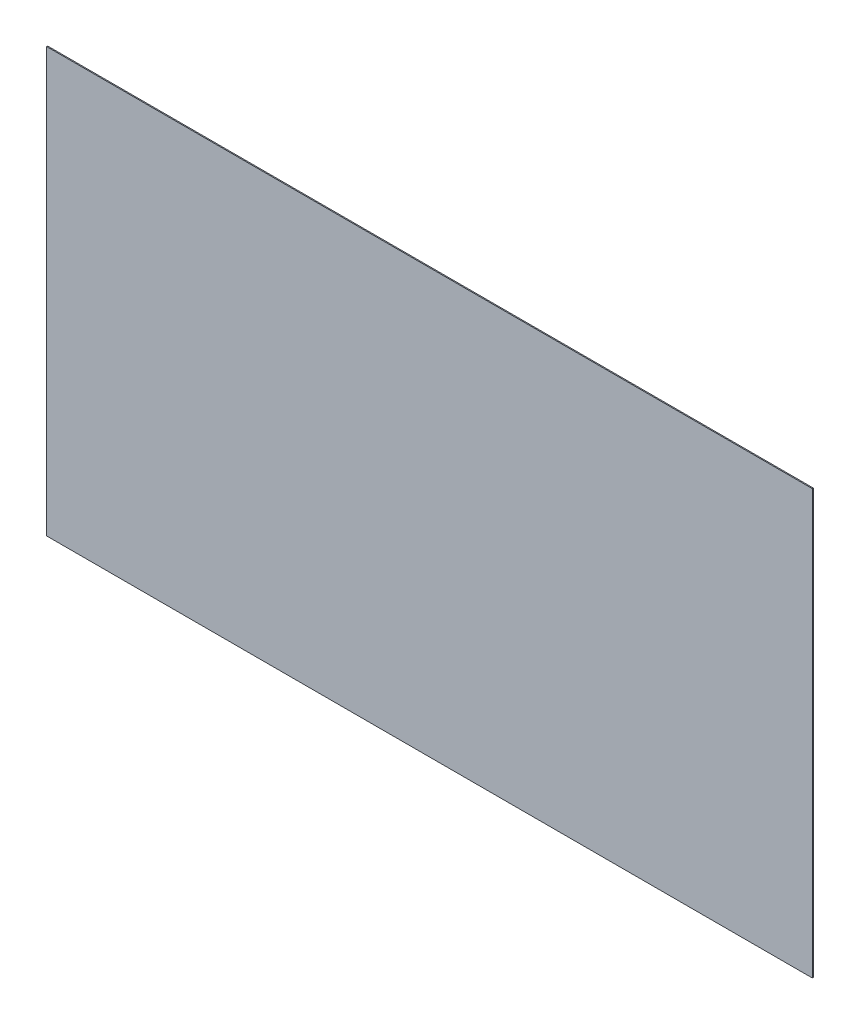
ISO-10303-21;
HEADER;
FILE_DESCRIPTION(('STEP AP214'),'2;1');
FILE_NAME('part.step','',(''),(''),'','','');
FILE_SCHEMA(('AUTOMOTIVE_DESIGN { 1 0 10303 214 1 1 1 1 }'));
ENDSEC;
DATA;
#1=APPLICATION_CONTEXT('core data for automotive mechanical design processes');
#2=APPLICATION_PROTOCOL_DEFINITION('international standard','automotive_design',2000,#1);
#3=PRODUCT_CONTEXT('',#1,'mechanical');
#4=PRODUCT('Part','Part','',(#3));
#5=PRODUCT_RELATED_PRODUCT_CATEGORY('part','',(#4));
#6=PRODUCT_DEFINITION_FORMATION('','',#4);
#7=PRODUCT_DEFINITION_CONTEXT('part definition',#1,'design');
#8=PRODUCT_DEFINITION('design','',#6,#7);
#9=PRODUCT_DEFINITION_SHAPE('','',#8);
#10=(LENGTH_UNIT() NAMED_UNIT(*) SI_UNIT(.MILLI.,.METRE.));
#11=(NAMED_UNIT(*) PLANE_ANGLE_UNIT() SI_UNIT($,.RADIAN.));
#12=(NAMED_UNIT(*) SI_UNIT($,.STERADIAN.) SOLID_ANGLE_UNIT());
#13=UNCERTAINTY_MEASURE_WITH_UNIT(LENGTH_MEASURE(1.E-05),#10,'distance_accuracy_value','');
#14=(GEOMETRIC_REPRESENTATION_CONTEXT(3) GLOBAL_UNCERTAINTY_ASSIGNED_CONTEXT((#13)) GLOBAL_UNIT_ASSIGNED_CONTEXT((#10,
#11,#12)) REPRESENTATION_CONTEXT('',''));
#15=CARTESIAN_POINT('',(0.,0.,0.));
#16=DIRECTION('',(0.,0.,1.));
#17=DIRECTION('',(1.,0.,0.));
#18=AXIS2_PLACEMENT_3D('',#15,#16,#17);
#19=CARTESIAN_POINT('',(-560.,310.,1.5));
#20=DIRECTION('',(1.,0.,0.));
#21=DIRECTION('',(0.,0.,-1.));
#22=AXIS2_PLACEMENT_3D('',#19,#20,#21);
#23=PLANE('',#22);
#24=DIRECTION('',(0.,-1.,0.));
#25=VECTOR('',#24,1.);
#26=CARTESIAN_POINT('',(-560.,310.,0.));
#27=LINE('',#26,#25);
#28=CARTESIAN_POINT('',(-560.,310.,0.));
#29=VERTEX_POINT('',#28);
#30=CARTESIAN_POINT('',(-560.,-310.,0.));
#31=VERTEX_POINT('',#30);
#32=EDGE_CURVE('E107',#29,#31,#27,.T.);
#33=ORIENTED_EDGE('',*,*,#32,.T.);
#34=DIRECTION('',(0.,0.,-1.));
#35=VECTOR('',#34,1.);
#36=CARTESIAN_POINT('',(-560.,-310.,1.5));
#37=LINE('',#36,#35);
#38=CARTESIAN_POINT('',(-560.,-310.,1.5));
#39=VERTEX_POINT('',#38);
#40=EDGE_CURVE('E11',#39,#31,#37,.T.);
#41=ORIENTED_EDGE('',*,*,#40,.F.);
#42=DIRECTION('',(0.,-1.,0.));
#43=VECTOR('',#42,1.);
#44=CARTESIAN_POINT('',(-560.,310.,1.5));
#45=LINE('',#44,#43);
#46=CARTESIAN_POINT('',(-560.,310.,1.5));
#47=VERTEX_POINT('',#46);
#48=EDGE_CURVE('E91',#47,#39,#45,.T.);
#49=ORIENTED_EDGE('',*,*,#48,.F.);
#50=DIRECTION('',(0.,0.,-1.));
#51=VECTOR('',#50,1.);
#52=CARTESIAN_POINT('',(-560.,310.,1.5));
#53=LINE('',#52,#51);
#54=EDGE_CURVE('E103',#47,#29,#53,.T.);
#55=ORIENTED_EDGE('',*,*,#54,.T.);
#56=EDGE_LOOP('',(#33,#41,#49,#55));
#57=FACE_BOUND('',#56,.T.);
#58=ADVANCED_FACE('F39',(#57),#23,.F.);
#59=CARTESIAN_POINT('',(560.,-310.,1.5));
#60=DIRECTION('',(0.,1.,0.));
#61=DIRECTION('',(-1.,0.,0.));
#62=AXIS2_PLACEMENT_3D('',#59,#60,#61);
#63=PLANE('',#62);
#64=DIRECTION('',(1.,0.,0.));
#65=VECTOR('',#64,1.);
#66=CARTESIAN_POINT('',(560.,-310.,0.));
#67=LINE('',#66,#65);
#68=CARTESIAN_POINT('',(560.,-310.,0.));
#69=VERTEX_POINT('',#68);
#70=EDGE_CURVE('E96',#31,#69,#67,.T.);
#71=ORIENTED_EDGE('',*,*,#70,.T.);
#72=DIRECTION('',(0.,0.,-1.));
#73=VECTOR('',#72,1.);
#74=CARTESIAN_POINT('',(560.,-310.,1.5));
#75=LINE('',#74,#73);
#76=CARTESIAN_POINT('',(560.,-310.,1.5));
#77=VERTEX_POINT('',#76);
#78=EDGE_CURVE('E48',#77,#69,#75,.T.);
#79=ORIENTED_EDGE('',*,*,#78,.F.);
#80=DIRECTION('',(1.,0.,0.));
#81=VECTOR('',#80,1.);
#82=CARTESIAN_POINT('',(560.,-310.,1.5));
#83=LINE('',#82,#81);
#84=EDGE_CURVE('E86',#39,#77,#83,.T.);
#85=ORIENTED_EDGE('',*,*,#84,.F.);
#86=ORIENTED_EDGE('',*,*,#40,.T.);
#87=EDGE_LOOP('',(#71,#79,#85,#86));
#88=FACE_BOUND('',#87,.T.);
#89=ADVANCED_FACE('F95',(#88),#63,.F.);
#90=CARTESIAN_POINT('',(560.,310.,1.5));
#91=DIRECTION('',(-1.,0.,0.));
#92=DIRECTION('',(0.,0.,1.));
#93=AXIS2_PLACEMENT_3D('',#90,#91,#92);
#94=PLANE('',#93);
#95=DIRECTION('',(0.,1.,0.));
#96=VECTOR('',#95,1.);
#97=CARTESIAN_POINT('',(560.,310.,0.));
#98=LINE('',#97,#96);
#99=CARTESIAN_POINT('',(560.,310.,0.));
#100=VERTEX_POINT('',#99);
#101=EDGE_CURVE('E73',#69,#100,#98,.T.);
#102=ORIENTED_EDGE('',*,*,#101,.T.);
#103=DIRECTION('',(0.,0.,-1.));
#104=VECTOR('',#103,1.);
#105=CARTESIAN_POINT('',(560.,310.,1.5));
#106=LINE('',#105,#104);
#107=CARTESIAN_POINT('',(560.,310.,1.5));
#108=VERTEX_POINT('',#107);
#109=EDGE_CURVE('E98',#108,#100,#106,.T.);
#110=ORIENTED_EDGE('',*,*,#109,.F.);
#111=DIRECTION('',(0.,1.,0.));
#112=VECTOR('',#111,1.);
#113=CARTESIAN_POINT('',(560.,310.,1.5));
#114=LINE('',#113,#112);
#115=EDGE_CURVE('E89',#77,#108,#114,.T.);
#116=ORIENTED_EDGE('',*,*,#115,.F.);
#117=ORIENTED_EDGE('',*,*,#78,.T.);
#118=EDGE_LOOP('',(#102,#110,#116,#117));
#119=FACE_BOUND('',#118,.T.);
#120=ADVANCED_FACE('F99',(#119),#94,.F.);
#121=CARTESIAN_POINT('',(560.,310.,1.5));
#122=DIRECTION('',(0.,-1.,0.));
#123=DIRECTION('',(1.,0.,0.));
#124=AXIS2_PLACEMENT_3D('',#121,#122,#123);
#125=PLANE('',#124);
#126=DIRECTION('',(-1.,0.,0.));
#127=VECTOR('',#126,1.);
#128=CARTESIAN_POINT('',(560.,310.,0.));
#129=LINE('',#128,#127);
#130=EDGE_CURVE('E79',#100,#29,#129,.T.);
#131=ORIENTED_EDGE('',*,*,#130,.T.);
#132=ORIENTED_EDGE('',*,*,#54,.F.);
#133=DIRECTION('',(-1.,0.,0.));
#134=VECTOR('',#133,1.);
#135=CARTESIAN_POINT('',(560.,310.,1.5));
#136=LINE('',#135,#134);
#137=EDGE_CURVE('E56',#108,#47,#136,.T.);
#138=ORIENTED_EDGE('',*,*,#137,.F.);
#139=ORIENTED_EDGE('',*,*,#109,.T.);
#140=EDGE_LOOP('',(#131,#132,#138,#139));
#141=FACE_BOUND('',#140,.T.);
#142=ADVANCED_FACE('F120',(#141),#125,.F.);
#143=CARTESIAN_POINT('',(0.,0.,1.5));
#144=DIRECTION('',(0.,0.,-1.));
#145=DIRECTION('',(-1.,0.,0.));
#146=AXIS2_PLACEMENT_3D('',#143,#144,#145);
#147=PLANE('',#146);
#148=ORIENTED_EDGE('',*,*,#48,.T.);
#149=ORIENTED_EDGE('',*,*,#84,.T.);
#150=ORIENTED_EDGE('',*,*,#115,.T.);
#151=ORIENTED_EDGE('',*,*,#137,.T.);
#152=EDGE_LOOP('',(#148,#149,#150,#151));
#153=FACE_BOUND('',#152,.T.);
#154=ADVANCED_FACE('F87',(#153),#147,.F.);
#155=CARTESIAN_POINT('',(0.,0.,0.));
#156=DIRECTION('',(0.,0.,-1.));
#157=DIRECTION('',(-1.,0.,0.));
#158=AXIS2_PLACEMENT_3D('',#155,#156,#157);
#159=PLANE('',#158);
#160=ORIENTED_EDGE('',*,*,#32,.F.);
#161=ORIENTED_EDGE('',*,*,#130,.F.);
#162=ORIENTED_EDGE('',*,*,#101,.F.);
#163=ORIENTED_EDGE('',*,*,#70,.F.);
#164=EDGE_LOOP('',(#160,#161,#162,#163));
#165=FACE_BOUND('',#164,.T.);
#166=ADVANCED_FACE('F123',(#165),#159,.T.);
#167=CLOSED_SHELL('',(#58,#89,#120,#142,#154,#166));
#168=MANIFOLD_SOLID_BREP('B2',#167);
#169=ADVANCED_BREP_SHAPE_REPRESENTATION('',(#18,#168),#14);
#170=SHAPE_DEFINITION_REPRESENTATION(#9,#169);
ENDSEC;
END-ISO-10303-21;
